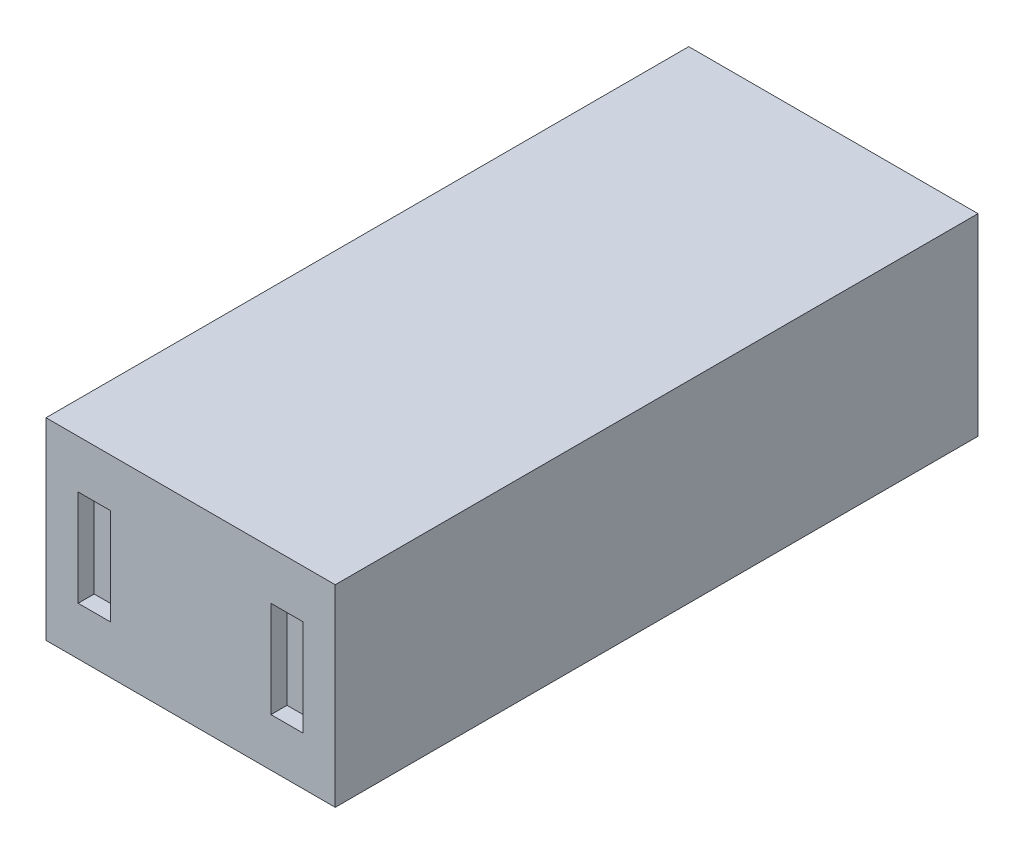
ISO-10303-21;
HEADER;
FILE_DESCRIPTION(('STEP AP214'),'2;1');
FILE_NAME('part.step','',(''),(''),'','','');
FILE_SCHEMA(('AUTOMOTIVE_DESIGN { 1 0 10303 214 1 1 1 1 }'));
ENDSEC;
DATA;
#1=APPLICATION_CONTEXT('core data for automotive mechanical design processes');
#2=APPLICATION_PROTOCOL_DEFINITION('international standard','automotive_design',2000,#1);
#3=PRODUCT_CONTEXT('',#1,'mechanical');
#4=PRODUCT('Part','Part','',(#3));
#5=PRODUCT_RELATED_PRODUCT_CATEGORY('part','',(#4));
#6=PRODUCT_DEFINITION_FORMATION('','',#4);
#7=PRODUCT_DEFINITION_CONTEXT('part definition',#1,'design');
#8=PRODUCT_DEFINITION('design','',#6,#7);
#9=PRODUCT_DEFINITION_SHAPE('','',#8);
#10=(LENGTH_UNIT() NAMED_UNIT(*) SI_UNIT(.MILLI.,.METRE.));
#11=(NAMED_UNIT(*) PLANE_ANGLE_UNIT() SI_UNIT($,.RADIAN.));
#12=(NAMED_UNIT(*) SI_UNIT($,.STERADIAN.) SOLID_ANGLE_UNIT());
#13=UNCERTAINTY_MEASURE_WITH_UNIT(LENGTH_MEASURE(1.E-05),#10,'distance_accuracy_value','');
#14=(GEOMETRIC_REPRESENTATION_CONTEXT(3) GLOBAL_UNCERTAINTY_ASSIGNED_CONTEXT((#13)) GLOBAL_UNIT_ASSIGNED_CONTEXT((#10,
#11,#12)) REPRESENTATION_CONTEXT('',''));
#15=CARTESIAN_POINT('',(0.,0.,0.));
#16=DIRECTION('',(0.,0.,1.));
#17=DIRECTION('',(1.,0.,0.));
#18=AXIS2_PLACEMENT_3D('',#15,#16,#17);
#19=CARTESIAN_POINT('',(45.,-30.,100.));
#20=DIRECTION('',(-1.,0.,0.));
#21=DIRECTION('',(0.,0.,1.));
#22=AXIS2_PLACEMENT_3D('',#19,#20,#21);
#23=PLANE('',#22);
#24=DIRECTION('',(0.,1.,0.));
#25=VECTOR('',#24,1.);
#26=CARTESIAN_POINT('',(45.,-30.,-100.));
#27=LINE('',#26,#25);
#28=CARTESIAN_POINT('',(45.,-30.,-100.));
#29=VERTEX_POINT('',#28);
#30=CARTESIAN_POINT('',(45.,30.,-100.));
#31=VERTEX_POINT('',#30);
#32=EDGE_CURVE('E176',#29,#31,#27,.T.);
#33=ORIENTED_EDGE('',*,*,#32,.T.);
#34=DIRECTION('',(0.,0.,-1.));
#35=VECTOR('',#34,1.);
#36=CARTESIAN_POINT('',(45.,30.,100.));
#37=LINE('',#36,#35);
#38=CARTESIAN_POINT('',(45.,30.,100.));
#39=VERTEX_POINT('',#38);
#40=EDGE_CURVE('E11',#39,#31,#37,.T.);
#41=ORIENTED_EDGE('',*,*,#40,.F.);
#42=DIRECTION('',(0.,1.,0.));
#43=VECTOR('',#42,1.);
#44=CARTESIAN_POINT('',(45.,-30.,100.));
#45=LINE('',#44,#43);
#46=CARTESIAN_POINT('',(45.,-30.,100.));
#47=VERTEX_POINT('',#46);
#48=EDGE_CURVE('E224',#47,#39,#45,.T.);
#49=ORIENTED_EDGE('',*,*,#48,.F.);
#50=DIRECTION('',(0.,0.,-1.));
#51=VECTOR('',#50,1.);
#52=CARTESIAN_POINT('',(45.,-30.,100.));
#53=LINE('',#52,#51);
#54=EDGE_CURVE('E238',#47,#29,#53,.T.);
#55=ORIENTED_EDGE('',*,*,#54,.T.);
#56=EDGE_LOOP('',(#33,#41,#49,#55));
#57=FACE_BOUND('',#56,.T.);
#58=ADVANCED_FACE('F42',(#57),#23,.F.);
#59=CARTESIAN_POINT('',(-45.,30.,100.));
#60=DIRECTION('',(0.,-1.,0.));
#61=DIRECTION('',(0.,0.,-1.));
#62=AXIS2_PLACEMENT_3D('',#59,#60,#61);
#63=PLANE('',#62);
#64=DIRECTION('',(-1.,0.,0.));
#65=VECTOR('',#64,1.);
#66=CARTESIAN_POINT('',(-45.,30.,-100.));
#67=LINE('',#66,#65);
#68=CARTESIAN_POINT('',(-45.,30.,-100.));
#69=VERTEX_POINT('',#68);
#70=EDGE_CURVE('E242',#31,#69,#67,.T.);
#71=ORIENTED_EDGE('',*,*,#70,.T.);
#72=DIRECTION('',(0.,0.,-1.));
#73=VECTOR('',#72,1.);
#74=CARTESIAN_POINT('',(-45.,30.,100.));
#75=LINE('',#74,#73);
#76=CARTESIAN_POINT('',(-45.,30.,100.));
#77=VERTEX_POINT('',#76);
#78=EDGE_CURVE('E50',#77,#69,#75,.T.);
#79=ORIENTED_EDGE('',*,*,#78,.F.);
#80=DIRECTION('',(-1.,0.,0.));
#81=VECTOR('',#80,1.);
#82=CARTESIAN_POINT('',(-45.,30.,100.));
#83=LINE('',#82,#81);
#84=EDGE_CURVE('E228',#39,#77,#83,.T.);
#85=ORIENTED_EDGE('',*,*,#84,.F.);
#86=ORIENTED_EDGE('',*,*,#40,.T.);
#87=EDGE_LOOP('',(#71,#79,#85,#86));
#88=FACE_BOUND('',#87,.T.);
#89=ADVANCED_FACE('F278',(#88),#63,.F.);
#90=CARTESIAN_POINT('',(-45.,-30.,100.));
#91=DIRECTION('',(1.,0.,0.));
#92=DIRECTION('',(0.,0.,-1.));
#93=AXIS2_PLACEMENT_3D('',#90,#91,#92);
#94=PLANE('',#93);
#95=DIRECTION('',(0.,-1.,0.));
#96=VECTOR('',#95,1.);
#97=CARTESIAN_POINT('',(-45.,-30.,-100.));
#98=LINE('',#97,#96);
#99=CARTESIAN_POINT('',(-45.,-30.,-100.));
#100=VERTEX_POINT('',#99);
#101=EDGE_CURVE('E245',#69,#100,#98,.T.);
#102=ORIENTED_EDGE('',*,*,#101,.T.);
#103=DIRECTION('',(0.,0.,-1.));
#104=VECTOR('',#103,1.);
#105=CARTESIAN_POINT('',(-45.,-30.,100.));
#106=LINE('',#105,#104);
#107=CARTESIAN_POINT('',(-45.,-30.,100.));
#108=VERTEX_POINT('',#107);
#109=EDGE_CURVE('E253',#108,#100,#106,.T.);
#110=ORIENTED_EDGE('',*,*,#109,.F.);
#111=DIRECTION('',(0.,-1.,0.));
#112=VECTOR('',#111,1.);
#113=CARTESIAN_POINT('',(-45.,-30.,100.));
#114=LINE('',#113,#112);
#115=EDGE_CURVE('E232',#77,#108,#114,.T.);
#116=ORIENTED_EDGE('',*,*,#115,.F.);
#117=ORIENTED_EDGE('',*,*,#78,.T.);
#118=EDGE_LOOP('',(#102,#110,#116,#117));
#119=FACE_BOUND('',#118,.T.);
#120=ADVANCED_FACE('F262',(#119),#94,.F.);
#121=CARTESIAN_POINT('',(-45.,-30.,100.));
#122=DIRECTION('',(0.,1.,0.));
#123=DIRECTION('',(0.,0.,1.));
#124=AXIS2_PLACEMENT_3D('',#121,#122,#123);
#125=PLANE('',#124);
#126=DIRECTION('',(1.,0.,0.));
#127=VECTOR('',#126,1.);
#128=CARTESIAN_POINT('',(-45.,-30.,-100.));
#129=LINE('',#128,#127);
#130=EDGE_CURVE('E229',#100,#29,#129,.T.);
#131=ORIENTED_EDGE('',*,*,#130,.T.);
#132=ORIENTED_EDGE('',*,*,#54,.F.);
#133=DIRECTION('',(1.,0.,0.));
#134=VECTOR('',#133,1.);
#135=CARTESIAN_POINT('',(-45.,-30.,100.));
#136=LINE('',#135,#134);
#137=EDGE_CURVE('E235',#108,#47,#136,.T.);
#138=ORIENTED_EDGE('',*,*,#137,.F.);
#139=ORIENTED_EDGE('',*,*,#109,.T.);
#140=EDGE_LOOP('',(#131,#132,#138,#139));
#141=FACE_BOUND('',#140,.T.);
#142=ADVANCED_FACE('F271',(#141),#125,.F.);
#143=CARTESIAN_POINT('',(0.,0.,100.));
#144=DIRECTION('',(0.,0.,-1.));
#145=DIRECTION('',(-1.,0.,0.));
#146=AXIS2_PLACEMENT_3D('',#143,#144,#145);
#147=PLANE('',#146);
#148=DIRECTION('',(-1.,0.,0.));
#149=VECTOR('',#148,1.);
#150=CARTESIAN_POINT('',(-35.,15.,100.));
#151=LINE('',#150,#149);
#152=CARTESIAN_POINT('',(-25.,15.,100.));
#153=VERTEX_POINT('',#152);
#154=CARTESIAN_POINT('',(-35.,15.,100.));
#155=VERTEX_POINT('',#154);
#156=EDGE_CURVE('E167',#153,#155,#151,.T.);
#157=ORIENTED_EDGE('',*,*,#156,.F.);
#158=DIRECTION('',(0.,1.,0.));
#159=VECTOR('',#158,1.);
#160=CARTESIAN_POINT('',(-25.,-15.,100.));
#161=LINE('',#160,#159);
#162=CARTESIAN_POINT('',(-25.,-15.,100.));
#163=VERTEX_POINT('',#162);
#164=EDGE_CURVE('E57',#163,#153,#161,.T.);
#165=ORIENTED_EDGE('',*,*,#164,.F.);
#166=DIRECTION('',(1.,0.,0.));
#167=VECTOR('',#166,1.);
#168=CARTESIAN_POINT('',(-35.,-15.,100.));
#169=LINE('',#168,#167);
#170=CARTESIAN_POINT('',(-35.,-15.,100.));
#171=VERTEX_POINT('',#170);
#172=EDGE_CURVE('E154',#171,#163,#169,.T.);
#173=ORIENTED_EDGE('',*,*,#172,.F.);
#174=DIRECTION('',(0.,-1.,0.));
#175=VECTOR('',#174,1.);
#176=CARTESIAN_POINT('',(-35.,-15.,100.));
#177=LINE('',#176,#175);
#178=EDGE_CURVE('E158',#155,#171,#177,.T.);
#179=ORIENTED_EDGE('',*,*,#178,.F.);
#180=EDGE_LOOP('',(#157,#165,#173,#179));
#181=FACE_BOUND('',#180,.T.);
#182=DIRECTION('',(-1.,0.,0.));
#183=VECTOR('',#182,1.);
#184=CARTESIAN_POINT('',(34.9999999999999,15.0000000000004,100.));
#185=LINE('',#184,#183);
#186=CARTESIAN_POINT('',(34.9999999999999,15.0000000000004,100.));
#187=VERTEX_POINT('',#186);
#188=CARTESIAN_POINT('',(24.9999999999999,15.,100.));
#189=VERTEX_POINT('',#188);
#190=EDGE_CURVE('E204',#187,#189,#185,.T.);
#191=ORIENTED_EDGE('',*,*,#190,.F.);
#192=DIRECTION('',(0.,1.,0.));
#193=VECTOR('',#192,1.);
#194=CARTESIAN_POINT('',(35.0000000000001,-14.9999999999998,100.));
#195=LINE('',#194,#193);
#196=CARTESIAN_POINT('',(35.0000000000001,-14.9999999999998,100.));
#197=VERTEX_POINT('',#196);
#198=EDGE_CURVE('E65',#197,#187,#195,.T.);
#199=ORIENTED_EDGE('',*,*,#198,.F.);
#200=DIRECTION('',(1.,0.,0.));
#201=VECTOR('',#200,1.);
#202=CARTESIAN_POINT('',(35.0000000000001,-14.9999999999998,100.));
#203=LINE('',#202,#201);
#204=CARTESIAN_POINT('',(25.0000000000001,-14.9999999999998,100.));
#205=VERTEX_POINT('',#204);
#206=EDGE_CURVE('E195',#205,#197,#203,.T.);
#207=ORIENTED_EDGE('',*,*,#206,.F.);
#208=DIRECTION('',(0.,-1.,0.));
#209=VECTOR('',#208,1.);
#210=CARTESIAN_POINT('',(25.0000000000001,-14.9999999999998,100.));
#211=LINE('',#210,#209);
#212=EDGE_CURVE('E199',#189,#205,#211,.T.);
#213=ORIENTED_EDGE('',*,*,#212,.F.);
#214=EDGE_LOOP('',(#191,#199,#207,#213));
#215=FACE_BOUND('',#214,.T.);
#216=ORIENTED_EDGE('',*,*,#48,.T.);
#217=ORIENTED_EDGE('',*,*,#84,.T.);
#218=ORIENTED_EDGE('',*,*,#115,.T.);
#219=ORIENTED_EDGE('',*,*,#137,.T.);
#220=EDGE_LOOP('',(#216,#217,#218,#219));
#221=FACE_BOUND('',#220,.T.);
#222=ADVANCED_FACE('F277',(#181,#215,#221),#147,.F.);
#223=CARTESIAN_POINT('',(0.,0.,-100.));
#224=DIRECTION('',(0.,0.,-1.));
#225=DIRECTION('',(-1.,0.,0.));
#226=AXIS2_PLACEMENT_3D('',#223,#224,#225);
#227=PLANE('',#226);
#228=ORIENTED_EDGE('',*,*,#32,.F.);
#229=ORIENTED_EDGE('',*,*,#130,.F.);
#230=ORIENTED_EDGE('',*,*,#101,.F.);
#231=ORIENTED_EDGE('',*,*,#70,.F.);
#232=EDGE_LOOP('',(#228,#229,#230,#231));
#233=FACE_BOUND('',#232,.T.);
#234=ADVANCED_FACE('F268',(#233),#227,.T.);
#235=CARTESIAN_POINT('',(35.0000000000001,-14.9999999999998,95.));
#236=DIRECTION('',(1.,0.,0.));
#237=DIRECTION('',(0.,1.,0.));
#238=AXIS2_PLACEMENT_3D('',#235,#236,#237);
#239=PLANE('',#238);
#240=ORIENTED_EDGE('',*,*,#198,.T.);
#241=DIRECTION('',(0.,0.,1.));
#242=VECTOR('',#241,1.);
#243=CARTESIAN_POINT('',(34.9999999999999,15.0000000000004,95.));
#244=LINE('',#243,#242);
#245=CARTESIAN_POINT('',(34.9999999999999,15.0000000000004,95.));
#246=VERTEX_POINT('',#245);
#247=EDGE_CURVE('E182',#246,#187,#244,.T.);
#248=ORIENTED_EDGE('',*,*,#247,.F.);
#249=DIRECTION('',(0.,1.,0.));
#250=VECTOR('',#249,1.);
#251=CARTESIAN_POINT('',(35.0000000000001,-14.9999999999998,95.));
#252=LINE('',#251,#250);
#253=CARTESIAN_POINT('',(35.0000000000001,-14.9999999999998,95.));
#254=VERTEX_POINT('',#253);
#255=EDGE_CURVE('E200',#254,#246,#252,.T.);
#256=ORIENTED_EDGE('',*,*,#255,.F.);
#257=DIRECTION('',(0.,0.,1.));
#258=VECTOR('',#257,1.);
#259=CARTESIAN_POINT('',(35.0000000000001,-14.9999999999998,95.));
#260=LINE('',#259,#258);
#261=EDGE_CURVE('E192',#254,#197,#260,.T.);
#262=ORIENTED_EDGE('',*,*,#261,.T.);
#263=EDGE_LOOP('',(#240,#248,#256,#262));
#264=FACE_BOUND('',#263,.T.);
#265=ADVANCED_FACE('F290',(#264),#239,.F.);
#266=CARTESIAN_POINT('',(35.0000000000001,-14.9999999999998,95.));
#267=DIRECTION('',(0.,-1.,0.));
#268=DIRECTION('',(0.,0.,-1.));
#269=AXIS2_PLACEMENT_3D('',#266,#267,#268);
#270=PLANE('',#269);
#271=ORIENTED_EDGE('',*,*,#206,.T.);
#272=ORIENTED_EDGE('',*,*,#261,.F.);
#273=DIRECTION('',(1.,0.,0.));
#274=VECTOR('',#273,1.);
#275=CARTESIAN_POINT('',(35.0000000000001,-14.9999999999998,95.));
#276=LINE('',#275,#274);
#277=CARTESIAN_POINT('',(25.0000000000001,-14.9999999999998,95.));
#278=VERTEX_POINT('',#277);
#279=EDGE_CURVE('E185',#278,#254,#276,.T.);
#280=ORIENTED_EDGE('',*,*,#279,.F.);
#281=DIRECTION('',(0.,0.,1.));
#282=VECTOR('',#281,1.);
#283=CARTESIAN_POINT('',(25.0000000000001,-14.9999999999998,95.));
#284=LINE('',#283,#282);
#285=EDGE_CURVE('E189',#278,#205,#284,.T.);
#286=ORIENTED_EDGE('',*,*,#285,.T.);
#287=EDGE_LOOP('',(#271,#272,#280,#286));
#288=FACE_BOUND('',#287,.T.);
#289=ADVANCED_FACE('F299',(#288),#270,.F.);
#290=CARTESIAN_POINT('',(25.0000000000001,-14.9999999999998,95.));
#291=DIRECTION('',(-1.,0.,0.));
#292=DIRECTION('',(0.,-1.,0.));
#293=AXIS2_PLACEMENT_3D('',#290,#291,#292);
#294=PLANE('',#293);
#295=ORIENTED_EDGE('',*,*,#212,.T.);
#296=ORIENTED_EDGE('',*,*,#285,.F.);
#297=DIRECTION('',(0.,-1.,0.));
#298=VECTOR('',#297,1.);
#299=CARTESIAN_POINT('',(25.0000000000001,-14.9999999999998,95.));
#300=LINE('',#299,#298);
#301=CARTESIAN_POINT('',(24.9999999999999,15.,95.));
#302=VERTEX_POINT('',#301);
#303=EDGE_CURVE('E213',#302,#278,#300,.T.);
#304=ORIENTED_EDGE('',*,*,#303,.F.);
#305=DIRECTION('',(0.,0.,1.));
#306=VECTOR('',#305,1.);
#307=CARTESIAN_POINT('',(24.9999999999999,15.,95.));
#308=LINE('',#307,#306);
#309=EDGE_CURVE('E186',#302,#189,#308,.T.);
#310=ORIENTED_EDGE('',*,*,#309,.T.);
#311=EDGE_LOOP('',(#295,#296,#304,#310));
#312=FACE_BOUND('',#311,.T.);
#313=ADVANCED_FACE('F302',(#312),#294,.F.);
#314=CARTESIAN_POINT('',(34.9999999999999,15.0000000000004,95.));
#315=DIRECTION('',(0.,1.,0.));
#316=DIRECTION('',(-1.,0.,0.));
#317=AXIS2_PLACEMENT_3D('',#314,#315,#316);
#318=PLANE('',#317);
#319=ORIENTED_EDGE('',*,*,#190,.T.);
#320=ORIENTED_EDGE('',*,*,#309,.F.);
#321=DIRECTION('',(-1.,0.,0.));
#322=VECTOR('',#321,1.);
#323=CARTESIAN_POINT('',(34.9999999999999,15.0000000000004,95.));
#324=LINE('',#323,#322);
#325=EDGE_CURVE('E217',#246,#302,#324,.T.);
#326=ORIENTED_EDGE('',*,*,#325,.F.);
#327=ORIENTED_EDGE('',*,*,#247,.T.);
#328=EDGE_LOOP('',(#319,#320,#326,#327));
#329=FACE_BOUND('',#328,.T.);
#330=ADVANCED_FACE('F297',(#329),#318,.F.);
#331=CARTESIAN_POINT('',(0.,0.,95.));
#332=DIRECTION('',(0.,0.,1.));
#333=DIRECTION('',(1.,0.,0.));
#334=AXIS2_PLACEMENT_3D('',#331,#332,#333);
#335=PLANE('',#334);
#336=ORIENTED_EDGE('',*,*,#255,.T.);
#337=ORIENTED_EDGE('',*,*,#325,.T.);
#338=ORIENTED_EDGE('',*,*,#303,.T.);
#339=ORIENTED_EDGE('',*,*,#279,.T.);
#340=EDGE_LOOP('',(#336,#337,#338,#339));
#341=FACE_BOUND('',#340,.T.);
#342=ADVANCED_FACE('F294',(#341),#335,.T.);
#343=CARTESIAN_POINT('',(-25.,-15.,95.));
#344=DIRECTION('',(1.,0.,0.));
#345=DIRECTION('',(0.,0.,-1.));
#346=AXIS2_PLACEMENT_3D('',#343,#344,#345);
#347=PLANE('',#346);
#348=ORIENTED_EDGE('',*,*,#164,.T.);
#349=DIRECTION('',(0.,0.,1.));
#350=VECTOR('',#349,1.);
#351=CARTESIAN_POINT('',(-25.,15.,95.));
#352=LINE('',#351,#350);
#353=CARTESIAN_POINT('',(-25.,15.,95.));
#354=VERTEX_POINT('',#353);
#355=EDGE_CURVE('E129',#354,#153,#352,.T.);
#356=ORIENTED_EDGE('',*,*,#355,.F.);
#357=DIRECTION('',(0.,1.,0.));
#358=VECTOR('',#357,1.);
#359=CARTESIAN_POINT('',(-25.,-15.,95.));
#360=LINE('',#359,#358);
#361=CARTESIAN_POINT('',(-25.,-15.,95.));
#362=VERTEX_POINT('',#361);
#363=EDGE_CURVE('E133',#362,#354,#360,.T.);
#364=ORIENTED_EDGE('',*,*,#363,.F.);
#365=DIRECTION('',(0.,0.,1.));
#366=VECTOR('',#365,1.);
#367=CARTESIAN_POINT('',(-25.,-15.,95.));
#368=LINE('',#367,#366);
#369=EDGE_CURVE('E173',#362,#163,#368,.T.);
#370=ORIENTED_EDGE('',*,*,#369,.T.);
#371=EDGE_LOOP('',(#348,#356,#364,#370));
#372=FACE_BOUND('',#371,.T.);
#373=ADVANCED_FACE('F131',(#372),#347,.F.);
#374=CARTESIAN_POINT('',(-35.,-15.,95.));
#375=DIRECTION('',(0.,-1.,0.));
#376=DIRECTION('',(0.,0.,-1.));
#377=AXIS2_PLACEMENT_3D('',#374,#375,#376);
#378=PLANE('',#377);
#379=ORIENTED_EDGE('',*,*,#172,.T.);
#380=ORIENTED_EDGE('',*,*,#369,.F.);
#381=DIRECTION('',(1.,0.,0.));
#382=VECTOR('',#381,1.);
#383=CARTESIAN_POINT('',(-35.,-15.,95.));
#384=LINE('',#383,#382);
#385=CARTESIAN_POINT('',(-35.,-15.,95.));
#386=VERTEX_POINT('',#385);
#387=EDGE_CURVE('E140',#386,#362,#384,.T.);
#388=ORIENTED_EDGE('',*,*,#387,.F.);
#389=DIRECTION('',(0.,0.,1.));
#390=VECTOR('',#389,1.);
#391=CARTESIAN_POINT('',(-35.,-15.,95.));
#392=LINE('',#391,#390);
#393=EDGE_CURVE('E177',#386,#171,#392,.T.);
#394=ORIENTED_EDGE('',*,*,#393,.T.);
#395=EDGE_LOOP('',(#379,#380,#388,#394));
#396=FACE_BOUND('',#395,.T.);
#397=ADVANCED_FACE('F314',(#396),#378,.F.);
#398=CARTESIAN_POINT('',(-35.,-15.,95.));
#399=DIRECTION('',(-1.,0.,0.));
#400=DIRECTION('',(0.,0.,1.));
#401=AXIS2_PLACEMENT_3D('',#398,#399,#400);
#402=PLANE('',#401);
#403=ORIENTED_EDGE('',*,*,#178,.T.);
#404=ORIENTED_EDGE('',*,*,#393,.F.);
#405=DIRECTION('',(0.,-1.,0.));
#406=VECTOR('',#405,1.);
#407=CARTESIAN_POINT('',(-35.,-15.,95.));
#408=LINE('',#407,#406);
#409=CARTESIAN_POINT('',(-35.,15.,95.));
#410=VERTEX_POINT('',#409);
#411=EDGE_CURVE('E149',#410,#386,#408,.T.);
#412=ORIENTED_EDGE('',*,*,#411,.F.);
#413=DIRECTION('',(0.,0.,1.));
#414=VECTOR('',#413,1.);
#415=CARTESIAN_POINT('',(-35.,15.,95.));
#416=LINE('',#415,#414);
#417=EDGE_CURVE('E139',#410,#155,#416,.T.);
#418=ORIENTED_EDGE('',*,*,#417,.T.);
#419=EDGE_LOOP('',(#403,#404,#412,#418));
#420=FACE_BOUND('',#419,.T.);
#421=ADVANCED_FACE('F317',(#420),#402,.F.);
#422=CARTESIAN_POINT('',(-35.,15.,95.));
#423=DIRECTION('',(0.,1.,0.));
#424=DIRECTION('',(0.,0.,1.));
#425=AXIS2_PLACEMENT_3D('',#422,#423,#424);
#426=PLANE('',#425);
#427=ORIENTED_EDGE('',*,*,#156,.T.);
#428=ORIENTED_EDGE('',*,*,#417,.F.);
#429=DIRECTION('',(-1.,0.,0.));
#430=VECTOR('',#429,1.);
#431=CARTESIAN_POINT('',(-35.,15.,95.));
#432=LINE('',#431,#430);
#433=EDGE_CURVE('E143',#354,#410,#432,.T.);
#434=ORIENTED_EDGE('',*,*,#433,.F.);
#435=ORIENTED_EDGE('',*,*,#355,.T.);
#436=EDGE_LOOP('',(#427,#428,#434,#435));
#437=FACE_BOUND('',#436,.T.);
#438=ADVANCED_FACE('F144',(#437),#426,.F.);
#439=CARTESIAN_POINT('',(0.,0.,95.));
#440=DIRECTION('',(0.,0.,-1.));
#441=DIRECTION('',(-1.,0.,0.));
#442=AXIS2_PLACEMENT_3D('',#439,#440,#441);
#443=PLANE('',#442);
#444=ORIENTED_EDGE('',*,*,#363,.T.);
#445=ORIENTED_EDGE('',*,*,#433,.T.);
#446=ORIENTED_EDGE('',*,*,#411,.T.);
#447=ORIENTED_EDGE('',*,*,#387,.T.);
#448=EDGE_LOOP('',(#444,#445,#446,#447));
#449=FACE_BOUND('',#448,.T.);
#450=ADVANCED_FACE('F151',(#449),#443,.F.);
#451=CLOSED_SHELL('',(#58,#89,#120,#142,#222,#234,#265,#289,#313,#330,#342,#373,#397,#421,#438,#450));
#452=MANIFOLD_SOLID_BREP('B2',#451);
#453=ADVANCED_BREP_SHAPE_REPRESENTATION('',(#18,#452),#14);
#454=SHAPE_DEFINITION_REPRESENTATION(#9,#453);
ENDSEC;
END-ISO-10303-21;
